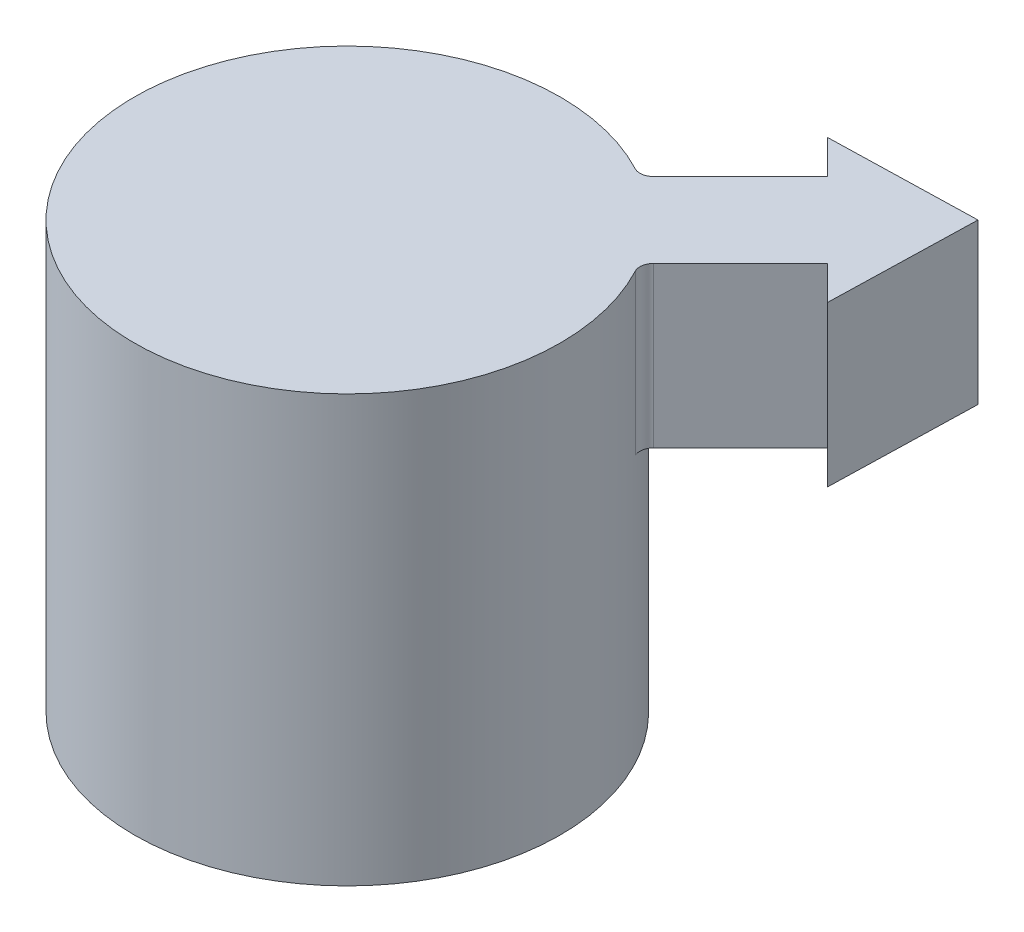
ISO-10303-21;
HEADER;
FILE_DESCRIPTION(('STEP AP214'),'2;1');
FILE_NAME('part.step','',(''),(''),'','','');
FILE_SCHEMA(('AUTOMOTIVE_DESIGN { 1 0 10303 214 1 1 1 1 }'));
ENDSEC;
DATA;
#1=APPLICATION_CONTEXT('core data for automotive mechanical design processes');
#2=APPLICATION_PROTOCOL_DEFINITION('international standard','automotive_design',2000,#1);
#3=PRODUCT_CONTEXT('',#1,'mechanical');
#4=PRODUCT('Part','Part','',(#3));
#5=PRODUCT_RELATED_PRODUCT_CATEGORY('part','',(#4));
#6=PRODUCT_DEFINITION_FORMATION('','',#4);
#7=PRODUCT_DEFINITION_CONTEXT('part definition',#1,'design');
#8=PRODUCT_DEFINITION('design','',#6,#7);
#9=PRODUCT_DEFINITION_SHAPE('','',#8);
#10=(LENGTH_UNIT() NAMED_UNIT(*) SI_UNIT(.MILLI.,.METRE.));
#11=(NAMED_UNIT(*) PLANE_ANGLE_UNIT() SI_UNIT($,.RADIAN.));
#12=(NAMED_UNIT(*) SI_UNIT($,.STERADIAN.) SOLID_ANGLE_UNIT());
#13=UNCERTAINTY_MEASURE_WITH_UNIT(LENGTH_MEASURE(1.E-05),#10,'distance_accuracy_value','');
#14=(GEOMETRIC_REPRESENTATION_CONTEXT(3) GLOBAL_UNCERTAINTY_ASSIGNED_CONTEXT((#13)) GLOBAL_UNIT_ASSIGNED_CONTEXT((#10,
#11,#12)) REPRESENTATION_CONTEXT('',''));
#15=CARTESIAN_POINT('',(0.,0.,0.));
#16=DIRECTION('',(0.,0.,1.));
#17=DIRECTION('',(1.,0.,0.));
#18=AXIS2_PLACEMENT_3D('',#15,#16,#17);
#19=CARTESIAN_POINT('',(0.,12.,0.));
#20=DIRECTION('',(0.,-1.,0.));
#21=DIRECTION('',(0.,0.,-1.));
#22=AXIS2_PLACEMENT_3D('',#19,#20,#21);
#23=CYLINDRICAL_SURFACE('',#22,5.6);
#24=CARTESIAN_POINT('',(0.,0.,0.));
#25=DIRECTION('',(0.,-1.,0.));
#26=DIRECTION('',(0.,0.,-1.));
#27=AXIS2_PLACEMENT_3D('',#24,#25,#26);
#28=CIRCLE('',#27,5.6);
#29=CARTESIAN_POINT('',(0.,0.,-5.6));
#30=VERTEX_POINT('',#29);
#31=EDGE_CURVE('E211',#30,#30,#28,.T.);
#32=ORIENTED_EDGE('',*,*,#31,.T.);
#33=EDGE_LOOP('',(#32));
#34=FACE_BOUND('',#33,.T.);
#35=CARTESIAN_POINT('',(0.,10.,0.));
#36=DIRECTION('',(0.,1.,0.));
#37=DIRECTION('',(0.,0.,1.));
#38=AXIS2_PLACEMENT_3D('',#35,#36,#37);
#39=CIRCLE('',#38,5.6);
#40=CARTESIAN_POINT('',(0.,10.,5.6));
#41=VERTEX_POINT('',#40);
#42=EDGE_CURVE('E11',#41,#41,#39,.F.);
#43=ORIENTED_EDGE('',*,*,#42,.F.);
#44=EDGE_LOOP('',(#43));
#45=FACE_BOUND('',#44,.T.);
#46=ADVANCED_FACE('F43',(#34,#45),#23,.F.);
#47=CARTESIAN_POINT('',(0.,16.,0.));
#48=DIRECTION('',(0.,-1.,0.));
#49=DIRECTION('',(0.,0.,-1.));
#50=AXIS2_PLACEMENT_3D('',#47,#48,#49);
#51=CYLINDRICAL_SURFACE('',#50,8.);
#52=DIRECTION('',(0.,1.,0.));
#53=VECTOR('',#52,1.);
#54=CARTESIAN_POINT('',(3.74286653512626,10.,-7.07042785835709));
#55=LINE('',#54,#53);
#56=CARTESIAN_POINT('',(3.74286653512626,10.,-7.07042785835709));
#57=VERTEX_POINT('',#56);
#58=CARTESIAN_POINT('',(3.74286653512626,16.,-7.07042785835709));
#59=VERTEX_POINT('',#58);
#60=EDGE_CURVE('E195',#57,#59,#55,.T.);
#61=ORIENTED_EDGE('',*,*,#60,.F.);
#62=CARTESIAN_POINT('',(0.,10.,0.));
#63=DIRECTION('',(0.,1.,0.));
#64=DIRECTION('',(0.,0.,1.));
#65=AXIS2_PLACEMENT_3D('',#62,#63,#64);
#66=CIRCLE('',#65,8.);
#67=CARTESIAN_POINT('',(7.07042785835707,10.,-3.74286653512628));
#68=VERTEX_POINT('',#67);
#69=EDGE_CURVE('E190',#68,#57,#66,.T.);
#70=ORIENTED_EDGE('',*,*,#69,.F.);
#71=DIRECTION('',(0.,1.,0.));
#72=VECTOR('',#71,1.);
#73=CARTESIAN_POINT('',(7.07042785835707,10.,-3.74286653512628));
#74=LINE('',#73,#72);
#75=CARTESIAN_POINT('',(7.07042785835707,16.,-3.74286653512628));
#76=VERTEX_POINT('',#75);
#77=EDGE_CURVE('E138',#68,#76,#74,.T.);
#78=ORIENTED_EDGE('',*,*,#77,.T.);
#79=CARTESIAN_POINT('',(0.,16.,0.));
#80=DIRECTION('',(0.,1.,0.));
#81=DIRECTION('',(0.,0.,1.));
#82=AXIS2_PLACEMENT_3D('',#79,#80,#81);
#83=CIRCLE('',#82,8.);
#84=EDGE_CURVE('E52',#59,#76,#83,.T.);
#85=ORIENTED_EDGE('',*,*,#84,.F.);
#86=EDGE_LOOP('',(#61,#70,#78,#85));
#87=FACE_BOUND('',#86,.T.);
#88=CARTESIAN_POINT('',(0.,0.,0.));
#89=DIRECTION('',(0.,1.,0.));
#90=DIRECTION('',(0.,0.,1.));
#91=AXIS2_PLACEMENT_3D('',#88,#89,#90);
#92=CIRCLE('',#91,8.);
#93=CARTESIAN_POINT('',(0.,0.,8.));
#94=VERTEX_POINT('',#93);
#95=EDGE_CURVE('E215',#94,#94,#92,.T.);
#96=ORIENTED_EDGE('',*,*,#95,.T.);
#97=EDGE_LOOP('',(#96));
#98=FACE_BOUND('',#97,.T.);
#99=ADVANCED_FACE('F45',(#87,#98),#51,.T.);
#100=CARTESIAN_POINT('',(0.,16.,0.));
#101=DIRECTION('',(0.,1.,0.));
#102=DIRECTION('',(0.,0.,1.));
#103=AXIS2_PLACEMENT_3D('',#100,#101,#102);
#104=PLANE('',#103);
#105=ORIENTED_EDGE('',*,*,#84,.T.);
#106=CARTESIAN_POINT('',(7.51232959950439,16.,-3.97679569357167));
#107=DIRECTION('',(0.,-1.,0.));
#108=DIRECTION('',(0.,0.,1.));
#109=AXIS2_PLACEMENT_3D('',#106,#107,#108);
#110=CIRCLE('',#109,0.5);
#111=CARTESIAN_POINT('',(7.15877620891111,16.,-4.33034908416495));
#112=VERTEX_POINT('',#111);
#113=EDGE_CURVE('E178',#76,#112,#110,.T.);
#114=ORIENTED_EDGE('',*,*,#113,.T.);
#115=DIRECTION('',(0.707106781186546,0.,-0.707106781186549));
#116=VECTOR('',#115,1.);
#117=CARTESIAN_POINT('',(10.4269730433575,16.,-7.59854591861132));
#118=LINE('',#117,#116);
#119=CARTESIAN_POINT('',(10.4269730433575,16.,-7.59854591861132));
#120=VERTEX_POINT('',#119);
#121=EDGE_CURVE('E132',#112,#120,#118,.T.);
#122=ORIENTED_EDGE('',*,*,#121,.T.);
#123=DIRECTION('',(0.707106781186558,0.,0.707106781186537));
#124=VECTOR('',#123,1.);
#125=CARTESIAN_POINT('',(10.4269730433575,16.,-7.59854591861132));
#126=LINE('',#125,#124);
#127=CARTESIAN_POINT('',(11.6968366019037,16.,-6.3286823600651));
#128=VERTEX_POINT('',#127);
#129=EDGE_CURVE('E183',#120,#128,#126,.T.);
#130=ORIENTED_EDGE('',*,*,#129,.T.);
#131=DIRECTION('',(0.0261769483078765,0.,-0.999657324975557));
#132=VECTOR('',#131,1.);
#133=CARTESIAN_POINT('',(11.8411866057306,16.,-11.8411866057306));
#134=LINE('',#133,#132);
#135=CARTESIAN_POINT('',(11.8411866057306,16.,-11.8411866057306));
#136=VERTEX_POINT('',#135);
#137=EDGE_CURVE('E161',#128,#136,#134,.T.);
#138=ORIENTED_EDGE('',*,*,#137,.T.);
#139=DIRECTION('',(-0.999671430909481,0.,0.0256326007925564));
#140=VECTOR('',#139,1.);
#141=CARTESIAN_POINT('',(6.32575371247547,16.,-11.6997652494933));
#142=LINE('',#141,#140);
#143=CARTESIAN_POINT('',(6.32575371247547,16.,-11.6997652494933));
#144=VERTEX_POINT('',#143);
#145=EDGE_CURVE('E165',#136,#144,#142,.T.);
#146=ORIENTED_EDGE('',*,*,#145,.T.);
#147=DIRECTION('',(0.707106781186562,0.,0.707106781186533));
#148=VECTOR('',#147,1.);
#149=CARTESIAN_POINT('',(7.59854591861128,16.,-10.4269730433575));
#150=LINE('',#149,#148);
#151=CARTESIAN_POINT('',(7.59854591861128,16.,-10.4269730433575));
#152=VERTEX_POINT('',#151);
#153=EDGE_CURVE('E169',#144,#152,#150,.T.);
#154=ORIENTED_EDGE('',*,*,#153,.T.);
#155=DIRECTION('',(-0.707106781186545,0.,0.70710678118655));
#156=VECTOR('',#155,1.);
#157=CARTESIAN_POINT('',(7.59854591861128,16.,-10.4269730433575));
#158=LINE('',#157,#156);
#159=CARTESIAN_POINT('',(4.33034908416492,16.,-7.15877620891113));
#160=VERTEX_POINT('',#159);
#161=EDGE_CURVE('E173',#152,#160,#158,.T.);
#162=ORIENTED_EDGE('',*,*,#161,.T.);
#163=CARTESIAN_POINT('',(3.97679569357165,16.,-7.51232959950441));
#164=DIRECTION('',(0.,-1.,0.));
#165=DIRECTION('',(0.,0.,1.));
#166=AXIS2_PLACEMENT_3D('',#163,#164,#165);
#167=CIRCLE('',#166,0.500000000000002);
#168=EDGE_CURVE('E59',#160,#59,#167,.T.);
#169=ORIENTED_EDGE('',*,*,#168,.T.);
#170=EDGE_LOOP('',(#105,#114,#122,#130,#138,#146,#154,#162,#169));
#171=FACE_BOUND('',#170,.T.);
#172=ADVANCED_FACE('F225',(#171),#104,.T.);
#173=CARTESIAN_POINT('',(0.,0.,0.));
#174=DIRECTION('',(0.,1.,0.));
#175=DIRECTION('',(0.,0.,1.));
#176=AXIS2_PLACEMENT_3D('',#173,#174,#175);
#177=PLANE('',#176);
#178=ORIENTED_EDGE('',*,*,#31,.F.);
#179=EDGE_LOOP('',(#178));
#180=FACE_BOUND('',#179,.T.);
#181=ORIENTED_EDGE('',*,*,#95,.F.);
#182=EDGE_LOOP('',(#181));
#183=FACE_BOUND('',#182,.T.);
#184=ADVANCED_FACE('F222',(#180,#183),#177,.F.);
#185=CARTESIAN_POINT('',(7.51232959950439,10.,-3.97679569357167));
#186=DIRECTION('',(0.,1.,0.));
#187=DIRECTION('',(0.,0.,1.));
#188=AXIS2_PLACEMENT_3D('',#185,#186,#187);
#189=PLANE('',#188);
#190=ORIENTED_EDGE('',*,*,#42,.T.);
#191=EDGE_LOOP('',(#190));
#192=FACE_BOUND('',#191,.T.);
#193=ADVANCED_FACE('F224',(#192),#189,.F.);
#194=CARTESIAN_POINT('',(7.51232959950439,10.,-3.97679569357167));
#195=DIRECTION('',(0.,-1.,0.));
#196=DIRECTION('',(0.,0.,1.));
#197=AXIS2_PLACEMENT_3D('',#194,#195,#196);
#198=CIRCLE('',#197,0.5);
#199=CARTESIAN_POINT('',(7.15877620891111,10.,-4.33034908416495));
#200=VERTEX_POINT('',#199);
#201=EDGE_CURVE('E143',#68,#200,#198,.T.);
#202=ORIENTED_EDGE('',*,*,#201,.F.);
#203=ORIENTED_EDGE('',*,*,#69,.T.);
#204=CARTESIAN_POINT('',(3.97679569357165,10.,-7.51232959950441));
#205=DIRECTION('',(0.,-1.,0.));
#206=DIRECTION('',(0.,0.,1.));
#207=AXIS2_PLACEMENT_3D('',#204,#205,#206);
#208=CIRCLE('',#207,0.500000000000002);
#209=CARTESIAN_POINT('',(4.33034908416492,10.,-7.15877620891113));
#210=VERTEX_POINT('',#209);
#211=EDGE_CURVE('E151',#210,#57,#208,.T.);
#212=ORIENTED_EDGE('',*,*,#211,.F.);
#213=DIRECTION('',(-0.707106781186545,0.,0.70710678118655));
#214=VECTOR('',#213,1.);
#215=CARTESIAN_POINT('',(7.59854591861128,10.,-10.4269730433575));
#216=LINE('',#215,#214);
#217=CARTESIAN_POINT('',(7.59854591861128,10.,-10.4269730433575));
#218=VERTEX_POINT('',#217);
#219=EDGE_CURVE('E155',#218,#210,#216,.T.);
#220=ORIENTED_EDGE('',*,*,#219,.F.);
#221=DIRECTION('',(0.707106781186562,0.,0.707106781186533));
#222=VECTOR('',#221,1.);
#223=CARTESIAN_POINT('',(7.59854591861128,10.,-10.4269730433575));
#224=LINE('',#223,#222);
#225=CARTESIAN_POINT('',(6.32575371247547,10.,-11.6997652494933));
#226=VERTEX_POINT('',#225);
#227=EDGE_CURVE('E389',#226,#218,#224,.T.);
#228=ORIENTED_EDGE('',*,*,#227,.F.);
#229=DIRECTION('',(-0.999671430909481,0.,0.0256326007925564));
#230=VECTOR('',#229,1.);
#231=CARTESIAN_POINT('',(6.32575371247547,10.,-11.6997652494933));
#232=LINE('',#231,#230);
#233=CARTESIAN_POINT('',(11.8411866057306,10.,-11.8411866057306));
#234=VERTEX_POINT('',#233);
#235=EDGE_CURVE('E391',#234,#226,#232,.T.);
#236=ORIENTED_EDGE('',*,*,#235,.F.);
#237=DIRECTION('',(0.0261769483078765,0.,-0.999657324975557));
#238=VECTOR('',#237,1.);
#239=CARTESIAN_POINT('',(11.8411866057306,10.,-11.8411866057306));
#240=LINE('',#239,#238);
#241=CARTESIAN_POINT('',(11.6968366019037,10.,-6.3286823600651));
#242=VERTEX_POINT('',#241);
#243=EDGE_CURVE('E187',#242,#234,#240,.T.);
#244=ORIENTED_EDGE('',*,*,#243,.F.);
#245=DIRECTION('',(0.707106781186558,0.,0.707106781186537));
#246=VECTOR('',#245,1.);
#247=CARTESIAN_POINT('',(10.4269730433575,10.,-7.59854591861132));
#248=LINE('',#247,#246);
#249=CARTESIAN_POINT('',(10.4269730433575,10.,-7.59854591861132));
#250=VERTEX_POINT('',#249);
#251=EDGE_CURVE('E145',#250,#242,#248,.T.);
#252=ORIENTED_EDGE('',*,*,#251,.F.);
#253=DIRECTION('',(0.707106781186546,0.,-0.707106781186549));
#254=VECTOR('',#253,1.);
#255=CARTESIAN_POINT('',(10.4269730433575,10.,-7.59854591861132));
#256=LINE('',#255,#254);
#257=EDGE_CURVE('E129',#200,#250,#256,.T.);
#258=ORIENTED_EDGE('',*,*,#257,.F.);
#259=EDGE_LOOP('',(#202,#203,#212,#220,#228,#236,#244,#252,#258));
#260=FACE_BOUND('',#259,.T.);
#261=ADVANCED_FACE('F142',(#260),#189,.F.);
#262=CARTESIAN_POINT('',(11.8411866057306,10.,-11.8411866057306));
#263=DIRECTION('',(0.999657324975557,0.,0.0261769483078765));
#264=DIRECTION('',(0.0261769483078765,0.,-0.999657324975557));
#265=AXIS2_PLACEMENT_3D('',#262,#263,#264);
#266=PLANE('',#265);
#267=ORIENTED_EDGE('',*,*,#137,.F.);
#268=DIRECTION('',(0.,1.,0.));
#269=VECTOR('',#268,1.);
#270=CARTESIAN_POINT('',(11.6968366019037,10.,-6.3286823600651));
#271=LINE('',#270,#269);
#272=EDGE_CURVE('E68',#242,#128,#271,.T.);
#273=ORIENTED_EDGE('',*,*,#272,.F.);
#274=ORIENTED_EDGE('',*,*,#243,.T.);
#275=DIRECTION('',(0.,1.,0.));
#276=VECTOR('',#275,1.);
#277=CARTESIAN_POINT('',(11.8411866057306,10.,-11.8411866057306));
#278=LINE('',#277,#276);
#279=EDGE_CURVE('E106',#234,#136,#278,.T.);
#280=ORIENTED_EDGE('',*,*,#279,.T.);
#281=EDGE_LOOP('',(#267,#273,#274,#280));
#282=FACE_BOUND('',#281,.T.);
#283=ADVANCED_FACE('F244',(#282),#266,.T.);
#284=CARTESIAN_POINT('',(10.4269730433575,10.,-7.59854591861132));
#285=DIRECTION('',(-0.707106781186537,0.,0.707106781186558));
#286=DIRECTION('',(0.707106781186558,0.,0.707106781186537));
#287=AXIS2_PLACEMENT_3D('',#284,#285,#286);
#288=PLANE('',#287);
#289=ORIENTED_EDGE('',*,*,#129,.F.);
#290=DIRECTION('',(0.,1.,0.));
#291=VECTOR('',#290,1.);
#292=CARTESIAN_POINT('',(10.4269730433575,10.,-7.59854591861132));
#293=LINE('',#292,#291);
#294=EDGE_CURVE('E137',#250,#120,#293,.T.);
#295=ORIENTED_EDGE('',*,*,#294,.F.);
#296=ORIENTED_EDGE('',*,*,#251,.T.);
#297=ORIENTED_EDGE('',*,*,#272,.T.);
#298=EDGE_LOOP('',(#289,#295,#296,#297));
#299=FACE_BOUND('',#298,.T.);
#300=ADVANCED_FACE('F247',(#299),#288,.T.);
#301=CARTESIAN_POINT('',(10.4269730433575,10.,-7.59854591861132));
#302=DIRECTION('',(0.707106781186548,0.,0.707106781186546));
#303=DIRECTION('',(0.707106781186546,0.,-0.707106781186549));
#304=AXIS2_PLACEMENT_3D('',#301,#302,#303);
#305=PLANE('',#304);
#306=ORIENTED_EDGE('',*,*,#121,.F.);
#307=DIRECTION('',(0.,1.,0.));
#308=VECTOR('',#307,1.);
#309=CARTESIAN_POINT('',(7.15877620891111,10.,-4.33034908416495));
#310=LINE('',#309,#308);
#311=EDGE_CURVE('E126',#200,#112,#310,.T.);
#312=ORIENTED_EDGE('',*,*,#311,.F.);
#313=ORIENTED_EDGE('',*,*,#257,.T.);
#314=ORIENTED_EDGE('',*,*,#294,.T.);
#315=EDGE_LOOP('',(#306,#312,#313,#314));
#316=FACE_BOUND('',#315,.T.);
#317=ADVANCED_FACE('F128',(#316),#305,.T.);
#318=CARTESIAN_POINT('',(7.51232959950439,10.,-3.97679569357167));
#319=DIRECTION('',(0.,1.,0.));
#320=DIRECTION('',(0.,0.,1.));
#321=AXIS2_PLACEMENT_3D('',#318,#319,#320);
#322=CYLINDRICAL_SURFACE('',#321,0.5);
#323=ORIENTED_EDGE('',*,*,#113,.F.);
#324=ORIENTED_EDGE('',*,*,#77,.F.);
#325=ORIENTED_EDGE('',*,*,#201,.T.);
#326=ORIENTED_EDGE('',*,*,#311,.T.);
#327=EDGE_LOOP('',(#323,#324,#325,#326));
#328=FACE_BOUND('',#327,.T.);
#329=ADVANCED_FACE('F148',(#328),#322,.F.);
#330=CARTESIAN_POINT('',(3.97679569357165,10.,-7.51232959950441));
#331=DIRECTION('',(0.,1.,0.));
#332=DIRECTION('',(0.,0.,1.));
#333=AXIS2_PLACEMENT_3D('',#330,#331,#332);
#334=CYLINDRICAL_SURFACE('',#333,0.500000000000002);
#335=ORIENTED_EDGE('',*,*,#168,.F.);
#336=DIRECTION('',(0.,1.,0.));
#337=VECTOR('',#336,1.);
#338=CARTESIAN_POINT('',(4.33034908416492,10.,-7.15877620891113));
#339=LINE('',#338,#337);
#340=EDGE_CURVE('E198',#210,#160,#339,.T.);
#341=ORIENTED_EDGE('',*,*,#340,.F.);
#342=ORIENTED_EDGE('',*,*,#211,.T.);
#343=ORIENTED_EDGE('',*,*,#60,.T.);
#344=EDGE_LOOP('',(#335,#341,#342,#343));
#345=FACE_BOUND('',#344,.T.);
#346=ADVANCED_FACE('F258',(#345),#334,.F.);
#347=CARTESIAN_POINT('',(7.59854591861128,10.,-10.4269730433575));
#348=DIRECTION('',(-0.70710678118655,0.,-0.707106781186545));
#349=DIRECTION('',(-0.707106781186545,0.,0.70710678118655));
#350=AXIS2_PLACEMENT_3D('',#347,#348,#349);
#351=PLANE('',#350);
#352=ORIENTED_EDGE('',*,*,#161,.F.);
#353=DIRECTION('',(0.,1.,0.));
#354=VECTOR('',#353,1.);
#355=CARTESIAN_POINT('',(7.59854591861128,10.,-10.4269730433575));
#356=LINE('',#355,#354);
#357=EDGE_CURVE('E201',#218,#152,#356,.T.);
#358=ORIENTED_EDGE('',*,*,#357,.F.);
#359=ORIENTED_EDGE('',*,*,#219,.T.);
#360=ORIENTED_EDGE('',*,*,#340,.T.);
#361=EDGE_LOOP('',(#352,#358,#359,#360));
#362=FACE_BOUND('',#361,.T.);
#363=ADVANCED_FACE('F254',(#362),#351,.T.);
#364=CARTESIAN_POINT('',(7.59854591861128,10.,-10.4269730433575));
#365=DIRECTION('',(-0.707106781186533,0.,0.707106781186562));
#366=DIRECTION('',(0.707106781186562,0.,0.707106781186533));
#367=AXIS2_PLACEMENT_3D('',#364,#365,#366);
#368=PLANE('',#367);
#369=ORIENTED_EDGE('',*,*,#153,.F.);
#370=DIRECTION('',(0.,1.,0.));
#371=VECTOR('',#370,1.);
#372=CARTESIAN_POINT('',(6.32575371247547,10.,-11.6997652494933));
#373=LINE('',#372,#371);
#374=EDGE_CURVE('E204',#226,#144,#373,.T.);
#375=ORIENTED_EDGE('',*,*,#374,.F.);
#376=ORIENTED_EDGE('',*,*,#227,.T.);
#377=ORIENTED_EDGE('',*,*,#357,.T.);
#378=EDGE_LOOP('',(#369,#375,#376,#377));
#379=FACE_BOUND('',#378,.T.);
#380=ADVANCED_FACE('F251',(#379),#368,.T.);
#381=CARTESIAN_POINT('',(6.32575371247547,10.,-11.6997652494933));
#382=DIRECTION('',(-0.0256326007925564,0.,-0.999671430909481));
#383=DIRECTION('',(-0.999671430909481,0.,0.0256326007925564));
#384=AXIS2_PLACEMENT_3D('',#381,#382,#383);
#385=PLANE('',#384);
#386=ORIENTED_EDGE('',*,*,#145,.F.);
#387=ORIENTED_EDGE('',*,*,#279,.F.);
#388=ORIENTED_EDGE('',*,*,#235,.T.);
#389=ORIENTED_EDGE('',*,*,#374,.T.);
#390=EDGE_LOOP('',(#386,#387,#388,#389));
#391=FACE_BOUND('',#390,.T.);
#392=ADVANCED_FACE('F248',(#391),#385,.T.);
#393=CLOSED_SHELL('',(#46,#99,#172,#184,#193,#261,#283,#300,#317,#329,#346,#363,#380,#392));
#394=MANIFOLD_SOLID_BREP('B2',#393);
#395=ADVANCED_BREP_SHAPE_REPRESENTATION('',(#18,#394),#14);
#396=SHAPE_DEFINITION_REPRESENTATION(#9,#395);
ENDSEC;
END-ISO-10303-21;
